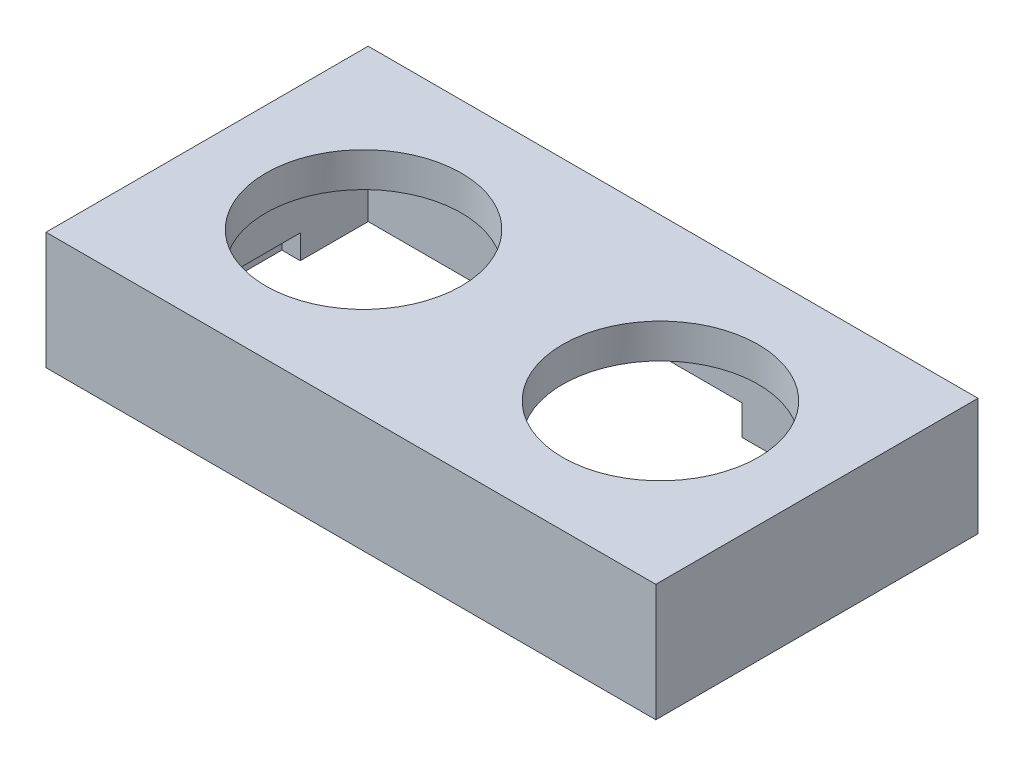
ISO-10303-21;
HEADER;
FILE_DESCRIPTION(('STEP AP214'),'2;1');
FILE_NAME('part.step','',(''),(''),'','','');
FILE_SCHEMA(('AUTOMOTIVE_DESIGN { 1 0 10303 214 1 1 1 1 }'));
ENDSEC;
DATA;
#1=APPLICATION_CONTEXT('core data for automotive mechanical design processes');
#2=APPLICATION_PROTOCOL_DEFINITION('international standard','automotive_design',2000,#1);
#3=PRODUCT_CONTEXT('',#1,'mechanical');
#4=PRODUCT('Part','Part','',(#3));
#5=PRODUCT_RELATED_PRODUCT_CATEGORY('part','',(#4));
#6=PRODUCT_DEFINITION_FORMATION('','',#4);
#7=PRODUCT_DEFINITION_CONTEXT('part definition',#1,'design');
#8=PRODUCT_DEFINITION('design','',#6,#7);
#9=PRODUCT_DEFINITION_SHAPE('','',#8);
#10=(LENGTH_UNIT() NAMED_UNIT(*) SI_UNIT(.MILLI.,.METRE.));
#11=(NAMED_UNIT(*) PLANE_ANGLE_UNIT() SI_UNIT($,.RADIAN.));
#12=(NAMED_UNIT(*) SI_UNIT($,.STERADIAN.) SOLID_ANGLE_UNIT());
#13=UNCERTAINTY_MEASURE_WITH_UNIT(LENGTH_MEASURE(1.E-05),#10,'distance_accuracy_value','');
#14=(GEOMETRIC_REPRESENTATION_CONTEXT(3) GLOBAL_UNCERTAINTY_ASSIGNED_CONTEXT((#13)) GLOBAL_UNIT_ASSIGNED_CONTEXT((#10,
#11,#12)) REPRESENTATION_CONTEXT('',''));
#15=CARTESIAN_POINT('',(0.,0.,0.));
#16=DIRECTION('',(0.,0.,1.));
#17=DIRECTION('',(1.,0.,0.));
#18=AXIS2_PLACEMENT_3D('',#15,#16,#17);
#19=CARTESIAN_POINT('',(0.,7.8098664338532,3.));
#20=DIRECTION('',(0.,1.,0.));
#21=DIRECTION('',(0.,0.,1.));
#22=AXIS2_PLACEMENT_3D('',#19,#20,#21);
#23=PLANE('',#22);
#24=DIRECTION('',(1.,0.,0.));
#25=VECTOR('',#24,1.);
#26=CARTESIAN_POINT('',(0.,7.8098664338532,19.1));
#27=LINE('',#26,#25);
#28=CARTESIAN_POINT('',(-25.1,7.8098664338532,19.1));
#29=VERTEX_POINT('',#28);
#30=CARTESIAN_POINT('',(-23.5,7.8098664338532,19.1));
#31=VERTEX_POINT('',#30);
#32=EDGE_CURVE('E302',#29,#31,#27,.T.);
#33=ORIENTED_EDGE('',*,*,#32,.T.);
#34=DIRECTION('',(0.,0.,-1.));
#35=VECTOR('',#34,1.);
#36=CARTESIAN_POINT('',(-23.5,7.8098664338533,0.));
#37=LINE('',#36,#35);
#38=CARTESIAN_POINT('',(-23.5,7.8098664338533,25.));
#39=VERTEX_POINT('',#38);
#40=EDGE_CURVE('E252',#39,#31,#37,.T.);
#41=ORIENTED_EDGE('',*,*,#40,.F.);
#42=DIRECTION('',(-1.,0.,0.));
#43=VECTOR('',#42,1.);
#44=CARTESIAN_POINT('',(0.,7.80986643385331,25.));
#45=LINE('',#44,#43);
#46=CARTESIAN_POINT('',(23.5,7.80986643385331,25.));
#47=VERTEX_POINT('',#46);
#48=EDGE_CURVE('E249',#47,#39,#45,.T.);
#49=ORIENTED_EDGE('',*,*,#48,.F.);
#50=DIRECTION('',(0.,0.,1.));
#51=VECTOR('',#50,1.);
#52=CARTESIAN_POINT('',(23.5,7.80986643385331,0.));
#53=LINE('',#52,#51);
#54=CARTESIAN_POINT('',(23.5,7.8098664338532,19.1));
#55=VERTEX_POINT('',#54);
#56=EDGE_CURVE('E248',#55,#47,#53,.T.);
#57=ORIENTED_EDGE('',*,*,#56,.F.);
#58=DIRECTION('',(-1.,0.,0.));
#59=VECTOR('',#58,1.);
#60=CARTESIAN_POINT('',(0.,7.8098664338532,19.1));
#61=LINE('',#60,#59);
#62=CARTESIAN_POINT('',(25.1,7.8098664338532,19.1));
#63=VERTEX_POINT('',#62);
#64=EDGE_CURVE('E303',#63,#55,#61,.T.);
#65=ORIENTED_EDGE('',*,*,#64,.F.);
#66=DIRECTION('',(0.,0.,1.));
#67=VECTOR('',#66,1.);
#68=CARTESIAN_POINT('',(25.1,7.8098664338532,0.));
#69=LINE('',#68,#67);
#70=CARTESIAN_POINT('',(25.1,7.8098664338532,8.9));
#71=VERTEX_POINT('',#70);
#72=EDGE_CURVE('E306',#71,#63,#69,.T.);
#73=ORIENTED_EDGE('',*,*,#72,.F.);
#74=DIRECTION('',(-1.,0.,0.));
#75=VECTOR('',#74,1.);
#76=CARTESIAN_POINT('',(0.,7.8098664338532,8.9));
#77=LINE('',#76,#75);
#78=CARTESIAN_POINT('',(23.5,7.8098664338532,8.9));
#79=VERTEX_POINT('',#78);
#80=EDGE_CURVE('E309',#71,#79,#77,.T.);
#81=ORIENTED_EDGE('',*,*,#80,.T.);
#82=CARTESIAN_POINT('',(23.5,7.80986643385331,3.));
#83=VERTEX_POINT('',#82);
#84=EDGE_CURVE('E245',#83,#79,#53,.T.);
#85=ORIENTED_EDGE('',*,*,#84,.F.);
#86=DIRECTION('',(1.,0.,0.));
#87=VECTOR('',#86,1.);
#88=CARTESIAN_POINT('',(0.,7.8098664338532,3.));
#89=LINE('',#88,#87);
#90=CARTESIAN_POINT('',(9.,7.8098664338532,3.));
#91=VERTEX_POINT('',#90);
#92=EDGE_CURVE('E194',#91,#83,#89,.T.);
#93=ORIENTED_EDGE('',*,*,#92,.F.);
#94=DIRECTION('',(0.,0.,1.));
#95=VECTOR('',#94,1.);
#96=CARTESIAN_POINT('',(9.,7.8098664338532,6.));
#97=LINE('',#96,#95);
#98=CARTESIAN_POINT('',(9.,7.8098664338532,0.));
#99=VERTEX_POINT('',#98);
#100=EDGE_CURVE('E282',#99,#91,#97,.T.);
#101=ORIENTED_EDGE('',*,*,#100,.F.);
#102=DIRECTION('',(1.,0.,0.));
#103=VECTOR('',#102,1.);
#104=CARTESIAN_POINT('',(0.,7.8098664338532,0.));
#105=LINE('',#104,#103);
#106=CARTESIAN_POINT('',(26.5,7.8098664338532,0.));
#107=VERTEX_POINT('',#106);
#108=EDGE_CURVE('E201',#99,#107,#105,.T.);
#109=ORIENTED_EDGE('',*,*,#108,.T.);
#110=DIRECTION('',(0.,0.,-1.));
#111=VECTOR('',#110,1.);
#112=CARTESIAN_POINT('',(26.5,7.8098664338532,3.));
#113=LINE('',#112,#111);
#114=CARTESIAN_POINT('',(26.5,7.80986643385331,28.));
#115=VERTEX_POINT('',#114);
#116=EDGE_CURVE('E43',#115,#107,#113,.T.);
#117=ORIENTED_EDGE('',*,*,#116,.F.);
#118=DIRECTION('',(-1.,0.,0.));
#119=VECTOR('',#118,1.);
#120=CARTESIAN_POINT('',(0.,7.80986643385331,28.));
#121=LINE('',#120,#119);
#122=CARTESIAN_POINT('',(-26.5,7.8098664338533,28.));
#123=VERTEX_POINT('',#122);
#124=EDGE_CURVE('E231',#115,#123,#121,.T.);
#125=ORIENTED_EDGE('',*,*,#124,.T.);
#126=DIRECTION('',(0.,0.,-1.));
#127=VECTOR('',#126,1.);
#128=CARTESIAN_POINT('',(-26.5,7.8098664338532,3.));
#129=LINE('',#128,#127);
#130=CARTESIAN_POINT('',(-26.5,7.8098664338532,0.));
#131=VERTEX_POINT('',#130);
#132=EDGE_CURVE('E11',#123,#131,#129,.T.);
#133=ORIENTED_EDGE('',*,*,#132,.T.);
#134=CARTESIAN_POINT('',(-9.,7.8098664338532,0.));
#135=VERTEX_POINT('',#134);
#136=EDGE_CURVE('E198',#131,#135,#105,.T.);
#137=ORIENTED_EDGE('',*,*,#136,.T.);
#138=DIRECTION('',(0.,0.,-1.));
#139=VECTOR('',#138,1.);
#140=CARTESIAN_POINT('',(-9.,7.8098664338532,6.));
#141=LINE('',#140,#139);
#142=CARTESIAN_POINT('',(-9.,7.8098664338532,3.));
#143=VERTEX_POINT('',#142);
#144=EDGE_CURVE('E279',#143,#135,#141,.T.);
#145=ORIENTED_EDGE('',*,*,#144,.F.);
#146=CARTESIAN_POINT('',(-23.5,7.8098664338533,3.));
#147=VERTEX_POINT('',#146);
#148=EDGE_CURVE('E204',#147,#143,#89,.T.);
#149=ORIENTED_EDGE('',*,*,#148,.F.);
#150=CARTESIAN_POINT('',(-23.5,7.8098664338532,8.9));
#151=VERTEX_POINT('',#150);
#152=EDGE_CURVE('E235',#151,#147,#37,.T.);
#153=ORIENTED_EDGE('',*,*,#152,.F.);
#154=DIRECTION('',(1.,0.,0.));
#155=VECTOR('',#154,1.);
#156=CARTESIAN_POINT('',(0.,7.8098664338532,8.9));
#157=LINE('',#156,#155);
#158=CARTESIAN_POINT('',(-25.1,7.8098664338532,8.9));
#159=VERTEX_POINT('',#158);
#160=EDGE_CURVE('E329',#159,#151,#157,.T.);
#161=ORIENTED_EDGE('',*,*,#160,.F.);
#162=DIRECTION('',(0.,0.,1.));
#163=VECTOR('',#162,1.);
#164=CARTESIAN_POINT('',(-25.1,7.8098664338532,0.));
#165=LINE('',#164,#163);
#166=EDGE_CURVE('E332',#159,#29,#165,.T.);
#167=ORIENTED_EDGE('',*,*,#166,.T.);
#168=EDGE_LOOP('',(#33,#41,#49,#57,#65,#73,#81,#85,#93,#101,#109,#117,#125,#133,#137,#145,#149,
#153,#161,#167));
#169=FACE_BOUND('',#168,.T.);
#170=ADVANCED_FACE('F35',(#169),#23,.F.);
#171=CARTESIAN_POINT('',(-23.5,7.8098664338533,0.));
#172=DIRECTION('',(1.,0.,0.));
#173=DIRECTION('',(0.,0.,-1.));
#174=AXIS2_PLACEMENT_3D('',#171,#172,#173);
#175=PLANE('',#174);
#176=ORIENTED_EDGE('',*,*,#40,.T.);
#177=DIRECTION('',(0.,-1.,0.));
#178=VECTOR('',#177,1.);
#179=CARTESIAN_POINT('',(-23.5,9.9098664338532,19.1));
#180=LINE('',#179,#178);
#181=CARTESIAN_POINT('',(-23.5,9.9098664338532,19.1));
#182=VERTEX_POINT('',#181);
#183=EDGE_CURVE('E284',#182,#31,#180,.T.);
#184=ORIENTED_EDGE('',*,*,#183,.F.);
#185=DIRECTION('',(0.,0.,1.));
#186=VECTOR('',#185,1.);
#187=CARTESIAN_POINT('',(-23.5,9.9098664338532,0.));
#188=LINE('',#187,#186);
#189=CARTESIAN_POINT('',(-23.5,9.9098664338532,8.9));
#190=VERTEX_POINT('',#189);
#191=EDGE_CURVE('E323',#190,#182,#188,.T.);
#192=ORIENTED_EDGE('',*,*,#191,.F.);
#193=DIRECTION('',(0.,-1.,0.));
#194=VECTOR('',#193,1.);
#195=CARTESIAN_POINT('',(-23.5,9.9098664338532,8.9));
#196=LINE('',#195,#194);
#197=EDGE_CURVE('E325',#190,#151,#196,.T.);
#198=ORIENTED_EDGE('',*,*,#197,.T.);
#199=ORIENTED_EDGE('',*,*,#152,.T.);
#200=DIRECTION('',(0.,1.,0.));
#201=VECTOR('',#200,1.);
#202=CARTESIAN_POINT('',(-23.5,7.8098664338533,3.));
#203=LINE('',#202,#201);
#204=CARTESIAN_POINT('',(-23.5,15.0098664338533,3.));
#205=VERTEX_POINT('',#204);
#206=EDGE_CURVE('E229',#147,#205,#203,.T.);
#207=ORIENTED_EDGE('',*,*,#206,.T.);
#208=DIRECTION('',(0.,0.,-1.));
#209=VECTOR('',#208,1.);
#210=CARTESIAN_POINT('',(-23.5,15.0098664338533,0.));
#211=LINE('',#210,#209);
#212=CARTESIAN_POINT('',(-23.5,15.0098664338533,25.));
#213=VERTEX_POINT('',#212);
#214=EDGE_CURVE('E239',#213,#205,#211,.T.);
#215=ORIENTED_EDGE('',*,*,#214,.F.);
#216=DIRECTION('',(0.,1.,0.));
#217=VECTOR('',#216,1.);
#218=CARTESIAN_POINT('',(-23.5,7.8098664338533,25.));
#219=LINE('',#218,#217);
#220=EDGE_CURVE('E220',#39,#213,#219,.T.);
#221=ORIENTED_EDGE('',*,*,#220,.F.);
#222=EDGE_LOOP('',(#176,#184,#192,#198,#199,#207,#215,#221));
#223=FACE_BOUND('',#222,.T.);
#224=ADVANCED_FACE('F350',(#223),#175,.T.);
#225=CARTESIAN_POINT('',(23.5,7.80986643385331,0.));
#226=DIRECTION('',(-1.,0.,0.));
#227=DIRECTION('',(0.,0.,1.));
#228=AXIS2_PLACEMENT_3D('',#225,#226,#227);
#229=PLANE('',#228);
#230=ORIENTED_EDGE('',*,*,#84,.T.);
#231=DIRECTION('',(0.,-1.,0.));
#232=VECTOR('',#231,1.);
#233=CARTESIAN_POINT('',(23.5,9.9098664338532,8.9));
#234=LINE('',#233,#232);
#235=CARTESIAN_POINT('',(23.5,9.9098664338532,8.9));
#236=VERTEX_POINT('',#235);
#237=EDGE_CURVE('E300',#236,#79,#234,.T.);
#238=ORIENTED_EDGE('',*,*,#237,.F.);
#239=DIRECTION('',(0.,0.,-1.));
#240=VECTOR('',#239,1.);
#241=CARTESIAN_POINT('',(23.5,9.9098664338532,0.));
#242=LINE('',#241,#240);
#243=CARTESIAN_POINT('',(23.5,9.9098664338532,19.1));
#244=VERTEX_POINT('',#243);
#245=EDGE_CURVE('E295',#244,#236,#242,.T.);
#246=ORIENTED_EDGE('',*,*,#245,.F.);
#247=DIRECTION('',(0.,-1.,0.));
#248=VECTOR('',#247,1.);
#249=CARTESIAN_POINT('',(23.5,9.9098664338532,19.1));
#250=LINE('',#249,#248);
#251=EDGE_CURVE('E297',#244,#55,#250,.T.);
#252=ORIENTED_EDGE('',*,*,#251,.T.);
#253=ORIENTED_EDGE('',*,*,#56,.T.);
#254=DIRECTION('',(0.,1.,0.));
#255=VECTOR('',#254,1.);
#256=CARTESIAN_POINT('',(23.5,7.80986643385331,25.));
#257=LINE('',#256,#255);
#258=CARTESIAN_POINT('',(23.5,15.0098664338533,25.));
#259=VERTEX_POINT('',#258);
#260=EDGE_CURVE('E224',#47,#259,#257,.T.);
#261=ORIENTED_EDGE('',*,*,#260,.T.);
#262=DIRECTION('',(0.,0.,1.));
#263=VECTOR('',#262,1.);
#264=CARTESIAN_POINT('',(23.5,15.0098664338533,0.));
#265=LINE('',#264,#263);
#266=CARTESIAN_POINT('',(23.5,15.0098664338533,3.));
#267=VERTEX_POINT('',#266);
#268=EDGE_CURVE('E232',#267,#259,#265,.T.);
#269=ORIENTED_EDGE('',*,*,#268,.F.);
#270=DIRECTION('',(0.,1.,0.));
#271=VECTOR('',#270,1.);
#272=CARTESIAN_POINT('',(23.5,7.80986643385331,3.));
#273=LINE('',#272,#271);
#274=EDGE_CURVE('E226',#83,#267,#273,.T.);
#275=ORIENTED_EDGE('',*,*,#274,.F.);
#276=EDGE_LOOP('',(#230,#238,#246,#252,#253,#261,#269,#275));
#277=FACE_BOUND('',#276,.T.);
#278=ADVANCED_FACE('F361',(#277),#229,.T.);
#279=CARTESIAN_POINT('',(-26.5,0.,3.));
#280=DIRECTION('',(1.,0.,0.));
#281=DIRECTION('',(0.,0.,-1.));
#282=AXIS2_PLACEMENT_3D('',#279,#280,#281);
#283=PLANE('',#282);
#284=DIRECTION('',(0.,0.,1.));
#285=VECTOR('',#284,1.);
#286=CARTESIAN_POINT('',(-26.5,18.0098664338533,3.));
#287=LINE('',#286,#285);
#288=CARTESIAN_POINT('',(-26.5,18.0098664338533,0.));
#289=VERTEX_POINT('',#288);
#290=CARTESIAN_POINT('',(-26.5,18.0098664338533,28.));
#291=VERTEX_POINT('',#290);
#292=EDGE_CURVE('E50',#289,#291,#287,.T.);
#293=ORIENTED_EDGE('',*,*,#292,.F.);
#294=DIRECTION('',(0.,-1.,0.));
#295=VECTOR('',#294,1.);
#296=CARTESIAN_POINT('',(-26.5,0.,0.));
#297=LINE('',#296,#295);
#298=EDGE_CURVE('E193',#289,#131,#297,.T.);
#299=ORIENTED_EDGE('',*,*,#298,.T.);
#300=ORIENTED_EDGE('',*,*,#132,.F.);
#301=DIRECTION('',(0.,1.,0.));
#302=VECTOR('',#301,1.);
#303=CARTESIAN_POINT('',(-26.5,15.0098664338533,28.));
#304=LINE('',#303,#302);
#305=EDGE_CURVE('E212',#123,#291,#304,.T.);
#306=ORIENTED_EDGE('',*,*,#305,.T.);
#307=EDGE_LOOP('',(#293,#299,#300,#306));
#308=FACE_BOUND('',#307,.T.);
#309=ADVANCED_FACE('F37',(#308),#283,.F.);
#310=CARTESIAN_POINT('',(26.5,0.,3.));
#311=DIRECTION('',(-1.,0.,0.));
#312=DIRECTION('',(0.,0.,1.));
#313=AXIS2_PLACEMENT_3D('',#310,#311,#312);
#314=PLANE('',#313);
#315=DIRECTION('',(0.,1.,0.));
#316=VECTOR('',#315,1.);
#317=CARTESIAN_POINT('',(26.5,0.,0.));
#318=LINE('',#317,#316);
#319=CARTESIAN_POINT('',(26.5,18.0098664338533,0.));
#320=VERTEX_POINT('',#319);
#321=EDGE_CURVE('E191',#107,#320,#318,.T.);
#322=ORIENTED_EDGE('',*,*,#321,.T.);
#323=DIRECTION('',(0.,0.,-1.));
#324=VECTOR('',#323,1.);
#325=CARTESIAN_POINT('',(26.5,18.0098664338533,28.));
#326=LINE('',#325,#324);
#327=CARTESIAN_POINT('',(26.5,18.0098664338533,28.));
#328=VERTEX_POINT('',#327);
#329=EDGE_CURVE('E174',#328,#320,#326,.T.);
#330=ORIENTED_EDGE('',*,*,#329,.F.);
#331=DIRECTION('',(0.,1.,0.));
#332=VECTOR('',#331,1.);
#333=CARTESIAN_POINT('',(26.5,15.0098664338533,28.));
#334=LINE('',#333,#332);
#335=EDGE_CURVE('E214',#115,#328,#334,.T.);
#336=ORIENTED_EDGE('',*,*,#335,.F.);
#337=ORIENTED_EDGE('',*,*,#116,.T.);
#338=EDGE_LOOP('',(#322,#330,#336,#337));
#339=FACE_BOUND('',#338,.T.);
#340=ADVANCED_FACE('F197',(#339),#314,.F.);
#341=CARTESIAN_POINT('',(0.,18.0098664338533,3.));
#342=DIRECTION('',(0.,-1.,0.));
#343=DIRECTION('',(0.,0.,-1.));
#344=AXIS2_PLACEMENT_3D('',#341,#342,#343);
#345=PLANE('',#344);
#346=DIRECTION('',(-1.,0.,0.));
#347=VECTOR('',#346,1.);
#348=CARTESIAN_POINT('',(0.,18.0098664338533,0.));
#349=LINE('',#348,#347);
#350=EDGE_CURVE('E178',#320,#289,#349,.T.);
#351=ORIENTED_EDGE('',*,*,#350,.T.);
#352=ORIENTED_EDGE('',*,*,#292,.T.);
#353=DIRECTION('',(1.,0.,0.));
#354=VECTOR('',#353,1.);
#355=CARTESIAN_POINT('',(-26.5,18.0098664338533,28.));
#356=LINE('',#355,#354);
#357=EDGE_CURVE('E181',#291,#328,#356,.T.);
#358=ORIENTED_EDGE('',*,*,#357,.T.);
#359=ORIENTED_EDGE('',*,*,#329,.T.);
#360=EDGE_LOOP('',(#351,#352,#358,#359));
#361=FACE_BOUND('',#360,.T.);
#362=CARTESIAN_POINT('',(-12.9,18.0098664338533,14.));
#363=DIRECTION('',(0.,-1.,0.));
#364=DIRECTION('',(0.,0.,-1.));
#365=AXIS2_PLACEMENT_3D('',#362,#363,#364);
#366=CIRCLE('',#365,8.5);
#367=CARTESIAN_POINT('',(-12.9,18.0098664338533,5.5));
#368=VERTEX_POINT('',#367);
#369=EDGE_CURVE('E242',#368,#368,#366,.T.);
#370=ORIENTED_EDGE('',*,*,#369,.T.);
#371=EDGE_LOOP('',(#370));
#372=FACE_BOUND('',#371,.T.);
#373=CARTESIAN_POINT('',(12.9,18.0098664338533,14.));
#374=DIRECTION('',(0.,-1.,0.));
#375=DIRECTION('',(0.,0.,-1.));
#376=AXIS2_PLACEMENT_3D('',#373,#374,#375);
#377=CIRCLE('',#376,8.49999999999999);
#378=CARTESIAN_POINT('',(12.9,18.0098664338533,5.5));
#379=VERTEX_POINT('',#378);
#380=EDGE_CURVE('E257',#379,#379,#377,.T.);
#381=ORIENTED_EDGE('',*,*,#380,.T.);
#382=EDGE_LOOP('',(#381));
#383=FACE_BOUND('',#382,.T.);
#384=ADVANCED_FACE('F176',(#361,#372,#383),#345,.F.);
#385=CARTESIAN_POINT('',(0.,0.,3.));
#386=DIRECTION('',(0.,0.,1.));
#387=DIRECTION('',(1.,0.,0.));
#388=AXIS2_PLACEMENT_3D('',#385,#386,#387);
#389=PLANE('',#388);
#390=DIRECTION('',(0.,1.,0.));
#391=VECTOR('',#390,1.);
#392=CARTESIAN_POINT('',(9.,0.,3.));
#393=LINE('',#392,#391);
#394=CARTESIAN_POINT('',(9.,10.4098664338532,3.));
#395=VERTEX_POINT('',#394);
#396=EDGE_CURVE('E264',#91,#395,#393,.T.);
#397=ORIENTED_EDGE('',*,*,#396,.F.);
#398=ORIENTED_EDGE('',*,*,#92,.T.);
#399=ORIENTED_EDGE('',*,*,#274,.T.);
#400=DIRECTION('',(-1.,0.,0.));
#401=VECTOR('',#400,1.);
#402=CARTESIAN_POINT('',(26.5,15.0098664338533,3.));
#403=LINE('',#402,#401);
#404=EDGE_CURVE('E185',#267,#205,#403,.T.);
#405=ORIENTED_EDGE('',*,*,#404,.T.);
#406=ORIENTED_EDGE('',*,*,#206,.F.);
#407=ORIENTED_EDGE('',*,*,#148,.T.);
#408=DIRECTION('',(0.,-1.,0.));
#409=VECTOR('',#408,1.);
#410=CARTESIAN_POINT('',(-9.,0.,3.));
#411=LINE('',#410,#409);
#412=CARTESIAN_POINT('',(-9.,10.4098664338532,3.));
#413=VERTEX_POINT('',#412);
#414=EDGE_CURVE('E268',#413,#143,#411,.T.);
#415=ORIENTED_EDGE('',*,*,#414,.F.);
#416=DIRECTION('',(1.,0.,0.));
#417=VECTOR('',#416,1.);
#418=CARTESIAN_POINT('',(0.,10.4098664338532,3.));
#419=LINE('',#418,#417);
#420=EDGE_CURVE('E270',#413,#395,#419,.T.);
#421=ORIENTED_EDGE('',*,*,#420,.T.);
#422=EDGE_LOOP('',(#397,#398,#399,#405,#406,#407,#415,#421));
#423=FACE_BOUND('',#422,.T.);
#424=ADVANCED_FACE('F382',(#423),#389,.T.);
#425=CARTESIAN_POINT('',(0.,0.,0.));
#426=DIRECTION('',(0.,0.,1.));
#427=DIRECTION('',(1.,0.,0.));
#428=AXIS2_PLACEMENT_3D('',#425,#426,#427);
#429=PLANE('',#428);
#430=ORIENTED_EDGE('',*,*,#298,.F.);
#431=ORIENTED_EDGE('',*,*,#350,.F.);
#432=ORIENTED_EDGE('',*,*,#321,.F.);
#433=ORIENTED_EDGE('',*,*,#108,.F.);
#434=DIRECTION('',(0.,-1.,0.));
#435=VECTOR('',#434,1.);
#436=CARTESIAN_POINT('',(9.,10.4098664338532,0.));
#437=LINE('',#436,#435);
#438=CARTESIAN_POINT('',(9.,10.4098664338532,0.));
#439=VERTEX_POINT('',#438);
#440=EDGE_CURVE('E273',#439,#99,#437,.T.);
#441=ORIENTED_EDGE('',*,*,#440,.F.);
#442=DIRECTION('',(1.,0.,0.));
#443=VECTOR('',#442,1.);
#444=CARTESIAN_POINT('',(-9.,10.4098664338532,0.));
#445=LINE('',#444,#443);
#446=CARTESIAN_POINT('',(-9.,10.4098664338532,0.));
#447=VERTEX_POINT('',#446);
#448=EDGE_CURVE('E277',#447,#439,#445,.T.);
#449=ORIENTED_EDGE('',*,*,#448,.F.);
#450=DIRECTION('',(0.,-1.,0.));
#451=VECTOR('',#450,1.);
#452=CARTESIAN_POINT('',(-9.,10.4098664338532,0.));
#453=LINE('',#452,#451);
#454=EDGE_CURVE('E274',#447,#135,#453,.T.);
#455=ORIENTED_EDGE('',*,*,#454,.T.);
#456=ORIENTED_EDGE('',*,*,#136,.F.);
#457=EDGE_LOOP('',(#430,#431,#432,#433,#441,#449,#455,#456));
#458=FACE_BOUND('',#457,.T.);
#459=ADVANCED_FACE('F189',(#458),#429,.F.);
#460=CARTESIAN_POINT('',(-26.5,15.0098664338533,28.));
#461=DIRECTION('',(0.,0.,1.));
#462=DIRECTION('',(1.,0.,0.));
#463=AXIS2_PLACEMENT_3D('',#460,#461,#462);
#464=PLANE('',#463);
#465=ORIENTED_EDGE('',*,*,#357,.F.);
#466=ORIENTED_EDGE('',*,*,#305,.F.);
#467=ORIENTED_EDGE('',*,*,#124,.F.);
#468=ORIENTED_EDGE('',*,*,#335,.T.);
#469=EDGE_LOOP('',(#465,#466,#467,#468));
#470=FACE_BOUND('',#469,.T.);
#471=ADVANCED_FACE('F421',(#470),#464,.T.);
#472=CARTESIAN_POINT('',(0.,15.0098664338533,0.));
#473=DIRECTION('',(0.,1.,0.));
#474=DIRECTION('',(-1.,0.,0.));
#475=AXIS2_PLACEMENT_3D('',#472,#473,#474);
#476=PLANE('',#475);
#477=CARTESIAN_POINT('',(-12.9,15.0098664338533,14.));
#478=DIRECTION('',(0.,-1.,0.));
#479=DIRECTION('',(1.,0.,0.));
#480=AXIS2_PLACEMENT_3D('',#477,#478,#479);
#481=CIRCLE('',#480,8.5);
#482=CARTESIAN_POINT('',(-4.4,15.0098664338533,14.));
#483=VERTEX_POINT('',#482);
#484=EDGE_CURVE('E260',#483,#483,#481,.T.);
#485=ORIENTED_EDGE('',*,*,#484,.F.);
#486=EDGE_LOOP('',(#485));
#487=FACE_BOUND('',#486,.T.);
#488=CARTESIAN_POINT('',(12.9,15.0098664338533,14.));
#489=DIRECTION('',(0.,-1.,0.));
#490=DIRECTION('',(1.,0.,0.));
#491=AXIS2_PLACEMENT_3D('',#488,#489,#490);
#492=CIRCLE('',#491,8.49999999999999);
#493=CARTESIAN_POINT('',(21.4,15.0098664338533,14.));
#494=VERTEX_POINT('',#493);
#495=EDGE_CURVE('E261',#494,#494,#492,.T.);
#496=ORIENTED_EDGE('',*,*,#495,.F.);
#497=EDGE_LOOP('',(#496));
#498=FACE_BOUND('',#497,.T.);
#499=DIRECTION('',(-1.,0.,0.));
#500=VECTOR('',#499,1.);
#501=CARTESIAN_POINT('',(0.,15.0098664338533,25.));
#502=LINE('',#501,#500);
#503=EDGE_CURVE('E236',#259,#213,#502,.T.);
#504=ORIENTED_EDGE('',*,*,#503,.T.);
#505=ORIENTED_EDGE('',*,*,#214,.T.);
#506=ORIENTED_EDGE('',*,*,#404,.F.);
#507=ORIENTED_EDGE('',*,*,#268,.T.);
#508=EDGE_LOOP('',(#504,#505,#506,#507));
#509=FACE_BOUND('',#508,.T.);
#510=ADVANCED_FACE('F384',(#487,#498,#509),#476,.F.);
#511=CARTESIAN_POINT('',(0.,7.80986643385331,25.));
#512=DIRECTION('',(0.,0.,-1.));
#513=DIRECTION('',(0.,1.,0.));
#514=AXIS2_PLACEMENT_3D('',#511,#512,#513);
#515=PLANE('',#514);
#516=ORIENTED_EDGE('',*,*,#503,.F.);
#517=ORIENTED_EDGE('',*,*,#260,.F.);
#518=ORIENTED_EDGE('',*,*,#48,.T.);
#519=ORIENTED_EDGE('',*,*,#220,.T.);
#520=EDGE_LOOP('',(#516,#517,#518,#519));
#521=FACE_BOUND('',#520,.T.);
#522=ADVANCED_FACE('F359',(#521),#515,.T.);
#523=CARTESIAN_POINT('',(12.9,22.2098664338533,14.));
#524=DIRECTION('',(0.,-1.,0.));
#525=DIRECTION('',(1.,0.,0.));
#526=AXIS2_PLACEMENT_3D('',#523,#524,#525);
#527=CYLINDRICAL_SURFACE('',#526,8.49999999999999);
#528=ORIENTED_EDGE('',*,*,#495,.T.);
#529=EDGE_LOOP('',(#528));
#530=FACE_BOUND('',#529,.T.);
#531=ORIENTED_EDGE('',*,*,#380,.F.);
#532=EDGE_LOOP('',(#531));
#533=FACE_BOUND('',#532,.T.);
#534=ADVANCED_FACE('F406',(#530,#533),#527,.F.);
#535=CARTESIAN_POINT('',(-12.9,22.2098664338533,14.));
#536=DIRECTION('',(0.,-1.,0.));
#537=DIRECTION('',(1.,0.,0.));
#538=AXIS2_PLACEMENT_3D('',#535,#536,#537);
#539=CYLINDRICAL_SURFACE('',#538,8.5);
#540=ORIENTED_EDGE('',*,*,#484,.T.);
#541=EDGE_LOOP('',(#540));
#542=FACE_BOUND('',#541,.T.);
#543=ORIENTED_EDGE('',*,*,#369,.F.);
#544=EDGE_LOOP('',(#543));
#545=FACE_BOUND('',#544,.T.);
#546=ADVANCED_FACE('F399',(#542,#545),#539,.F.);
#547=CARTESIAN_POINT('',(9.,10.4098664338532,6.));
#548=DIRECTION('',(1.,0.,0.));
#549=DIRECTION('',(0.,0.,-1.));
#550=AXIS2_PLACEMENT_3D('',#547,#548,#549);
#551=PLANE('',#550);
#552=ORIENTED_EDGE('',*,*,#396,.T.);
#553=DIRECTION('',(0.,0.,1.));
#554=VECTOR('',#553,1.);
#555=CARTESIAN_POINT('',(9.,10.4098664338532,6.));
#556=LINE('',#555,#554);
#557=EDGE_CURVE('E281',#439,#395,#556,.T.);
#558=ORIENTED_EDGE('',*,*,#557,.F.);
#559=ORIENTED_EDGE('',*,*,#440,.T.);
#560=ORIENTED_EDGE('',*,*,#100,.T.);
#561=EDGE_LOOP('',(#552,#558,#559,#560));
#562=FACE_BOUND('',#561,.T.);
#563=ADVANCED_FACE('F397',(#562),#551,.F.);
#564=CARTESIAN_POINT('',(-9.,10.4098664338532,6.));
#565=DIRECTION('',(-1.,0.,0.));
#566=DIRECTION('',(0.,0.,1.));
#567=AXIS2_PLACEMENT_3D('',#564,#565,#566);
#568=PLANE('',#567);
#569=ORIENTED_EDGE('',*,*,#414,.T.);
#570=ORIENTED_EDGE('',*,*,#144,.T.);
#571=ORIENTED_EDGE('',*,*,#454,.F.);
#572=DIRECTION('',(0.,0.,-1.));
#573=VECTOR('',#572,1.);
#574=CARTESIAN_POINT('',(-9.,10.4098664338532,6.));
#575=LINE('',#574,#573);
#576=EDGE_CURVE('E287',#413,#447,#575,.T.);
#577=ORIENTED_EDGE('',*,*,#576,.F.);
#578=EDGE_LOOP('',(#569,#570,#571,#577));
#579=FACE_BOUND('',#578,.T.);
#580=ADVANCED_FACE('F389',(#579),#568,.F.);
#581=CARTESIAN_POINT('',(0.,10.4098664338532,0.));
#582=DIRECTION('',(0.,-1.,0.));
#583=DIRECTION('',(0.,0.,-1.));
#584=AXIS2_PLACEMENT_3D('',#581,#582,#583);
#585=PLANE('',#584);
#586=ORIENTED_EDGE('',*,*,#576,.T.);
#587=ORIENTED_EDGE('',*,*,#448,.T.);
#588=ORIENTED_EDGE('',*,*,#557,.T.);
#589=ORIENTED_EDGE('',*,*,#420,.F.);
#590=EDGE_LOOP('',(#586,#587,#588,#589));
#591=FACE_BOUND('',#590,.T.);
#592=ADVANCED_FACE('F394',(#591),#585,.T.);
#593=CARTESIAN_POINT('',(0.,9.9098664338532,8.9));
#594=DIRECTION('',(0.,0.,1.));
#595=DIRECTION('',(1.,0.,0.));
#596=AXIS2_PLACEMENT_3D('',#593,#594,#595);
#597=PLANE('',#596);
#598=ORIENTED_EDGE('',*,*,#80,.F.);
#599=DIRECTION('',(0.,-1.,0.));
#600=VECTOR('',#599,1.);
#601=CARTESIAN_POINT('',(25.1,9.9098664338532,8.9));
#602=LINE('',#601,#600);
#603=CARTESIAN_POINT('',(25.1,9.9098664338532,8.9));
#604=VERTEX_POINT('',#603);
#605=EDGE_CURVE('E292',#604,#71,#602,.T.);
#606=ORIENTED_EDGE('',*,*,#605,.F.);
#607=DIRECTION('',(-1.,0.,0.));
#608=VECTOR('',#607,1.);
#609=CARTESIAN_POINT('',(0.,9.9098664338532,8.9));
#610=LINE('',#609,#608);
#611=EDGE_CURVE('E305',#604,#236,#610,.T.);
#612=ORIENTED_EDGE('',*,*,#611,.T.);
#613=ORIENTED_EDGE('',*,*,#237,.T.);
#614=EDGE_LOOP('',(#598,#606,#612,#613));
#615=FACE_BOUND('',#614,.T.);
#616=ADVANCED_FACE('F376',(#615),#597,.T.);
#617=CARTESIAN_POINT('',(0.,9.9098664338532,19.1));
#618=DIRECTION('',(0.,0.,1.));
#619=DIRECTION('',(1.,0.,0.));
#620=AXIS2_PLACEMENT_3D('',#617,#618,#619);
#621=PLANE('',#620);
#622=ORIENTED_EDGE('',*,*,#64,.T.);
#623=ORIENTED_EDGE('',*,*,#251,.F.);
#624=DIRECTION('',(-1.,0.,0.));
#625=VECTOR('',#624,1.);
#626=CARTESIAN_POINT('',(0.,9.9098664338532,19.1));
#627=LINE('',#626,#625);
#628=CARTESIAN_POINT('',(25.1,9.9098664338532,19.1));
#629=VERTEX_POINT('',#628);
#630=EDGE_CURVE('E314',#629,#244,#627,.T.);
#631=ORIENTED_EDGE('',*,*,#630,.F.);
#632=DIRECTION('',(0.,-1.,0.));
#633=VECTOR('',#632,1.);
#634=CARTESIAN_POINT('',(25.1,9.9098664338532,19.1));
#635=LINE('',#634,#633);
#636=EDGE_CURVE('E294',#629,#63,#635,.T.);
#637=ORIENTED_EDGE('',*,*,#636,.T.);
#638=EDGE_LOOP('',(#622,#623,#631,#637));
#639=FACE_BOUND('',#638,.T.);
#640=ADVANCED_FACE('F368',(#639),#621,.F.);
#641=CARTESIAN_POINT('',(25.1,9.9098664338532,0.));
#642=DIRECTION('',(1.,0.,0.));
#643=DIRECTION('',(0.,0.,-1.));
#644=AXIS2_PLACEMENT_3D('',#641,#642,#643);
#645=PLANE('',#644);
#646=ORIENTED_EDGE('',*,*,#72,.T.);
#647=ORIENTED_EDGE('',*,*,#636,.F.);
#648=DIRECTION('',(0.,0.,1.));
#649=VECTOR('',#648,1.);
#650=CARTESIAN_POINT('',(25.1,9.9098664338532,0.));
#651=LINE('',#650,#649);
#652=EDGE_CURVE('E316',#604,#629,#651,.T.);
#653=ORIENTED_EDGE('',*,*,#652,.F.);
#654=ORIENTED_EDGE('',*,*,#605,.T.);
#655=EDGE_LOOP('',(#646,#647,#653,#654));
#656=FACE_BOUND('',#655,.T.);
#657=ADVANCED_FACE('F372',(#656),#645,.F.);
#658=CARTESIAN_POINT('',(0.,9.9098664338532,0.));
#659=DIRECTION('',(0.,-1.,0.));
#660=DIRECTION('',(0.,0.,-1.));
#661=AXIS2_PLACEMENT_3D('',#658,#659,#660);
#662=PLANE('',#661);
#663=ORIENTED_EDGE('',*,*,#611,.F.);
#664=ORIENTED_EDGE('',*,*,#652,.T.);
#665=ORIENTED_EDGE('',*,*,#630,.T.);
#666=ORIENTED_EDGE('',*,*,#245,.T.);
#667=EDGE_LOOP('',(#663,#664,#665,#666));
#668=FACE_BOUND('',#667,.T.);
#669=ADVANCED_FACE('F519',(#668),#662,.T.);
#670=CARTESIAN_POINT('',(0.,9.9098664338532,19.1));
#671=DIRECTION('',(0.,0.,-1.));
#672=DIRECTION('',(-1.,0.,0.));
#673=AXIS2_PLACEMENT_3D('',#670,#671,#672);
#674=PLANE('',#673);
#675=ORIENTED_EDGE('',*,*,#32,.F.);
#676=DIRECTION('',(0.,-1.,0.));
#677=VECTOR('',#676,1.);
#678=CARTESIAN_POINT('',(-25.1,9.9098664338532,19.1));
#679=LINE('',#678,#677);
#680=CARTESIAN_POINT('',(-25.1,9.9098664338532,19.1));
#681=VERTEX_POINT('',#680);
#682=EDGE_CURVE('E320',#681,#29,#679,.T.);
#683=ORIENTED_EDGE('',*,*,#682,.F.);
#684=DIRECTION('',(1.,0.,0.));
#685=VECTOR('',#684,1.);
#686=CARTESIAN_POINT('',(0.,9.9098664338532,19.1));
#687=LINE('',#686,#685);
#688=EDGE_CURVE('E331',#681,#182,#687,.T.);
#689=ORIENTED_EDGE('',*,*,#688,.T.);
#690=ORIENTED_EDGE('',*,*,#183,.T.);
#691=EDGE_LOOP('',(#675,#683,#689,#690));
#692=FACE_BOUND('',#691,.T.);
#693=ADVANCED_FACE('F345',(#692),#674,.T.);
#694=CARTESIAN_POINT('',(0.,9.9098664338532,8.9));
#695=DIRECTION('',(0.,0.,-1.));
#696=DIRECTION('',(-1.,0.,0.));
#697=AXIS2_PLACEMENT_3D('',#694,#695,#696);
#698=PLANE('',#697);
#699=ORIENTED_EDGE('',*,*,#160,.T.);
#700=ORIENTED_EDGE('',*,*,#197,.F.);
#701=DIRECTION('',(1.,0.,0.));
#702=VECTOR('',#701,1.);
#703=CARTESIAN_POINT('',(0.,9.9098664338532,8.9));
#704=LINE('',#703,#702);
#705=CARTESIAN_POINT('',(-25.1,9.9098664338532,8.9));
#706=VERTEX_POINT('',#705);
#707=EDGE_CURVE('E58',#706,#190,#704,.T.);
#708=ORIENTED_EDGE('',*,*,#707,.F.);
#709=DIRECTION('',(0.,-1.,0.));
#710=VECTOR('',#709,1.);
#711=CARTESIAN_POINT('',(-25.1,9.9098664338532,8.9));
#712=LINE('',#711,#710);
#713=EDGE_CURVE('E322',#706,#159,#712,.T.);
#714=ORIENTED_EDGE('',*,*,#713,.T.);
#715=EDGE_LOOP('',(#699,#700,#708,#714));
#716=FACE_BOUND('',#715,.T.);
#717=ADVANCED_FACE('F537',(#716),#698,.F.);
#718=CARTESIAN_POINT('',(-25.1,9.9098664338532,0.));
#719=DIRECTION('',(1.,0.,0.));
#720=DIRECTION('',(0.,0.,-1.));
#721=AXIS2_PLACEMENT_3D('',#718,#719,#720);
#722=PLANE('',#721);
#723=ORIENTED_EDGE('',*,*,#166,.F.);
#724=ORIENTED_EDGE('',*,*,#713,.F.);
#725=DIRECTION('',(0.,0.,1.));
#726=VECTOR('',#725,1.);
#727=CARTESIAN_POINT('',(-25.1,9.9098664338532,0.));
#728=LINE('',#727,#726);
#729=EDGE_CURVE('E339',#706,#681,#728,.T.);
#730=ORIENTED_EDGE('',*,*,#729,.T.);
#731=ORIENTED_EDGE('',*,*,#682,.T.);
#732=EDGE_LOOP('',(#723,#724,#730,#731));
#733=FACE_BOUND('',#732,.T.);
#734=ADVANCED_FACE('F546',(#733),#722,.T.);
#735=CARTESIAN_POINT('',(0.,9.9098664338532,0.));
#736=DIRECTION('',(0.,-1.,0.));
#737=DIRECTION('',(0.,0.,-1.));
#738=AXIS2_PLACEMENT_3D('',#735,#736,#737);
#739=PLANE('',#738);
#740=ORIENTED_EDGE('',*,*,#688,.F.);
#741=ORIENTED_EDGE('',*,*,#729,.F.);
#742=ORIENTED_EDGE('',*,*,#707,.T.);
#743=ORIENTED_EDGE('',*,*,#191,.T.);
#744=EDGE_LOOP('',(#740,#741,#742,#743));
#745=FACE_BOUND('',#744,.T.);
#746=ADVANCED_FACE('F348',(#745),#739,.T.);
#747=CLOSED_SHELL('',(#170,#224,#278,#309,#340,#384,#424,#459,#471,#510,#522,#534,#546,#563,
#580,#592,#616,#640,#657,#669,#693,#717,#734,#746));
#748=MANIFOLD_SOLID_BREP('B2',#747);
#749=ADVANCED_BREP_SHAPE_REPRESENTATION('',(#18,#748),#14);
#750=SHAPE_DEFINITION_REPRESENTATION(#9,#749);
ENDSEC;
END-ISO-10303-21;
